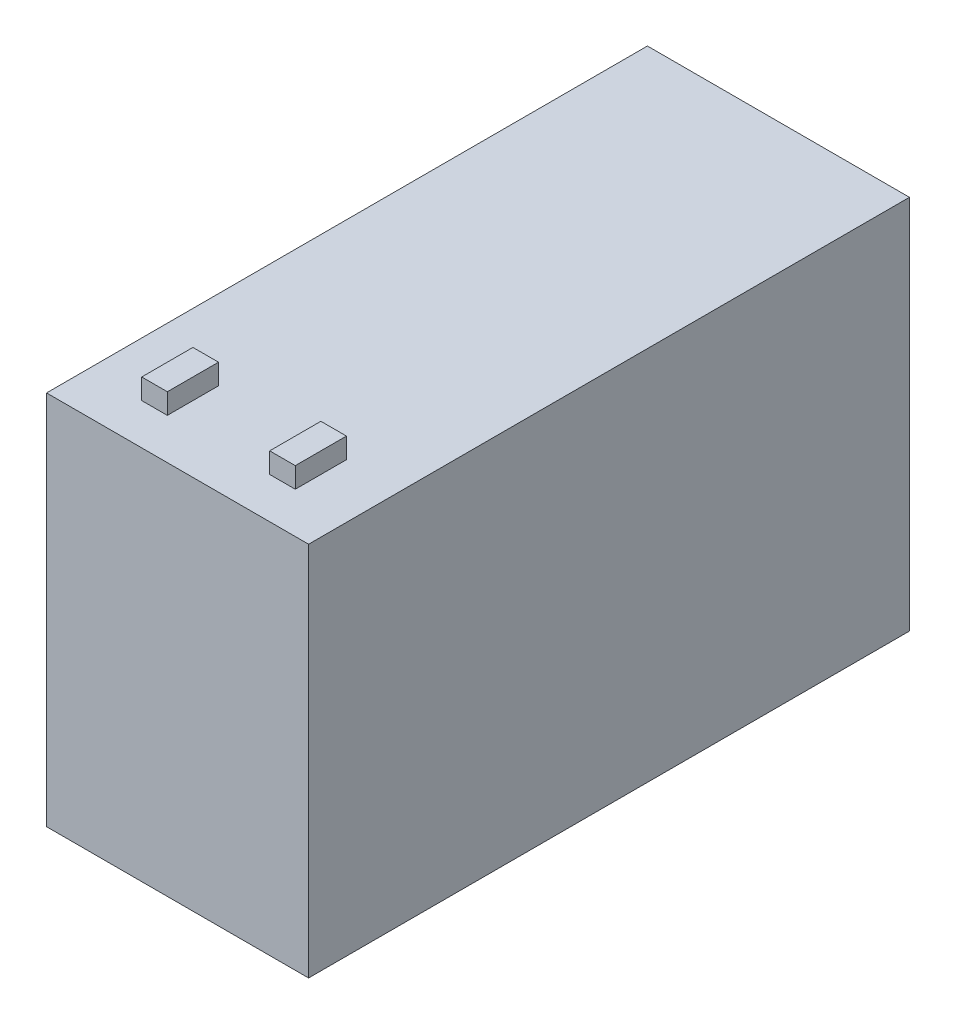
ISO-10303-21;
HEADER;
FILE_DESCRIPTION(('STEP AP214'),'2;1');
FILE_NAME('part.step','',(''),(''),'','','');
FILE_SCHEMA(('AUTOMOTIVE_DESIGN { 1 0 10303 214 1 1 1 1 }'));
ENDSEC;
DATA;
#1=APPLICATION_CONTEXT('core data for automotive mechanical design processes');
#2=APPLICATION_PROTOCOL_DEFINITION('international standard','automotive_design',2000,#1);
#3=PRODUCT_CONTEXT('',#1,'mechanical');
#4=PRODUCT('Part','Part','',(#3));
#5=PRODUCT_RELATED_PRODUCT_CATEGORY('part','',(#4));
#6=PRODUCT_DEFINITION_FORMATION('','',#4);
#7=PRODUCT_DEFINITION_CONTEXT('part definition',#1,'design');
#8=PRODUCT_DEFINITION('design','',#6,#7);
#9=PRODUCT_DEFINITION_SHAPE('','',#8);
#10=(LENGTH_UNIT() NAMED_UNIT(*) SI_UNIT(.MILLI.,.METRE.));
#11=(NAMED_UNIT(*) PLANE_ANGLE_UNIT() SI_UNIT($,.RADIAN.));
#12=(NAMED_UNIT(*) SI_UNIT($,.STERADIAN.) SOLID_ANGLE_UNIT());
#13=UNCERTAINTY_MEASURE_WITH_UNIT(LENGTH_MEASURE(1.E-05),#10,'distance_accuracy_value','');
#14=(GEOMETRIC_REPRESENTATION_CONTEXT(3) GLOBAL_UNCERTAINTY_ASSIGNED_CONTEXT((#13)) GLOBAL_UNIT_ASSIGNED_CONTEXT((#10,
#11,#12)) REPRESENTATION_CONTEXT('',''));
#15=CARTESIAN_POINT('',(0.,0.,0.));
#16=DIRECTION('',(0.,0.,1.));
#17=DIRECTION('',(1.,0.,0.));
#18=AXIS2_PLACEMENT_3D('',#15,#16,#17);
#19=CARTESIAN_POINT('',(0.,93.218,149.098));
#20=DIRECTION('',(0.,-1.,0.));
#21=DIRECTION('',(0.,0.,-1.));
#22=AXIS2_PLACEMENT_3D('',#19,#20,#21);
#23=PLANE('',#22);
#24=DIRECTION('',(0.,0.,-1.));
#25=VECTOR('',#24,1.);
#26=CARTESIAN_POINT('',(51.562,93.218,138.938));
#27=LINE('',#26,#25);
#28=CARTESIAN_POINT('',(51.562,93.218,138.938));
#29=VERTEX_POINT('',#28);
#30=CARTESIAN_POINT('',(51.562,93.218,126.238));
#31=VERTEX_POINT('',#30);
#32=EDGE_CURVE('E138',#29,#31,#27,.T.);
#33=ORIENTED_EDGE('',*,*,#32,.F.);
#34=DIRECTION('',(1.,0.,0.));
#35=VECTOR('',#34,1.);
#36=CARTESIAN_POINT('',(51.562,93.218,138.938));
#37=LINE('',#36,#35);
#38=CARTESIAN_POINT('',(45.212,93.218,138.938));
#39=VERTEX_POINT('',#38);
#40=EDGE_CURVE('E181',#39,#29,#37,.T.);
#41=ORIENTED_EDGE('',*,*,#40,.F.);
#42=DIRECTION('',(0.,0.,1.));
#43=VECTOR('',#42,1.);
#44=CARTESIAN_POINT('',(45.212,93.218,138.938));
#45=LINE('',#44,#43);
#46=CARTESIAN_POINT('',(45.212,93.218,126.238));
#47=VERTEX_POINT('',#46);
#48=EDGE_CURVE('E198',#47,#39,#45,.T.);
#49=ORIENTED_EDGE('',*,*,#48,.F.);
#50=DIRECTION('',(-1.,0.,0.));
#51=VECTOR('',#50,1.);
#52=CARTESIAN_POINT('',(51.562,93.218,126.238));
#53=LINE('',#52,#51);
#54=EDGE_CURVE('E194',#31,#47,#53,.T.);
#55=ORIENTED_EDGE('',*,*,#54,.F.);
#56=EDGE_LOOP('',(#33,#41,#49,#55));
#57=FACE_BOUND('',#56,.T.);
#58=DIRECTION('',(-1.,0.,0.));
#59=VECTOR('',#58,1.);
#60=CARTESIAN_POINT('',(0.,93.218,0.));
#61=LINE('',#60,#59);
#62=CARTESIAN_POINT('',(65.024,93.218,0.));
#63=VERTEX_POINT('',#62);
#64=CARTESIAN_POINT('',(0.,93.218,0.));
#65=VERTEX_POINT('',#64);
#66=EDGE_CURVE('E226',#63,#65,#61,.T.);
#67=ORIENTED_EDGE('',*,*,#66,.T.);
#68=DIRECTION('',(0.,0.,-1.));
#69=VECTOR('',#68,1.);
#70=CARTESIAN_POINT('',(0.,93.218,149.098));
#71=LINE('',#70,#69);
#72=CARTESIAN_POINT('',(0.,93.218,149.098));
#73=VERTEX_POINT('',#72);
#74=EDGE_CURVE('E235',#73,#65,#71,.T.);
#75=ORIENTED_EDGE('',*,*,#74,.F.);
#76=DIRECTION('',(-1.,0.,0.));
#77=VECTOR('',#76,1.);
#78=CARTESIAN_POINT('',(0.,93.218,149.098));
#79=LINE('',#78,#77);
#80=CARTESIAN_POINT('',(65.024,93.218,149.098));
#81=VERTEX_POINT('',#80);
#82=EDGE_CURVE('E232',#81,#73,#79,.T.);
#83=ORIENTED_EDGE('',*,*,#82,.F.);
#84=DIRECTION('',(0.,0.,-1.));
#85=VECTOR('',#84,1.);
#86=CARTESIAN_POINT('',(65.024,93.218,149.098));
#87=LINE('',#86,#85);
#88=EDGE_CURVE('E250',#81,#63,#87,.T.);
#89=ORIENTED_EDGE('',*,*,#88,.T.);
#90=EDGE_LOOP('',(#67,#75,#83,#89));
#91=FACE_BOUND('',#90,.T.);
#92=DIRECTION('',(1.,0.,0.));
#93=VECTOR('',#92,1.);
#94=CARTESIAN_POINT('',(13.462,93.218,138.938));
#95=LINE('',#94,#93);
#96=CARTESIAN_POINT('',(13.462,93.218,138.938));
#97=VERTEX_POINT('',#96);
#98=CARTESIAN_POINT('',(19.812,93.218,138.938));
#99=VERTEX_POINT('',#98);
#100=EDGE_CURVE('E131',#97,#99,#95,.T.);
#101=ORIENTED_EDGE('',*,*,#100,.F.);
#102=DIRECTION('',(0.,0.,1.));
#103=VECTOR('',#102,1.);
#104=CARTESIAN_POINT('',(13.462,93.218,138.938));
#105=LINE('',#104,#103);
#106=CARTESIAN_POINT('',(13.462,93.218,126.238));
#107=VERTEX_POINT('',#106);
#108=EDGE_CURVE('E133',#107,#97,#105,.T.);
#109=ORIENTED_EDGE('',*,*,#108,.F.);
#110=DIRECTION('',(-1.,0.,0.));
#111=VECTOR('',#110,1.);
#112=CARTESIAN_POINT('',(13.462,93.218,126.238));
#113=LINE('',#112,#111);
#114=CARTESIAN_POINT('',(19.812,93.218,126.238));
#115=VERTEX_POINT('',#114);
#116=EDGE_CURVE('E66',#115,#107,#113,.T.);
#117=ORIENTED_EDGE('',*,*,#116,.F.);
#118=DIRECTION('',(0.,0.,-1.));
#119=VECTOR('',#118,1.);
#120=CARTESIAN_POINT('',(19.812,93.218,138.938));
#121=LINE('',#120,#119);
#122=EDGE_CURVE('E61',#99,#115,#121,.T.);
#123=ORIENTED_EDGE('',*,*,#122,.F.);
#124=EDGE_LOOP('',(#101,#109,#117,#123));
#125=FACE_BOUND('',#124,.T.);
#126=ADVANCED_FACE('F45',(#57,#91,#125),#23,.F.);
#127=CARTESIAN_POINT('',(0.,0.,149.098));
#128=DIRECTION('',(1.,0.,0.));
#129=DIRECTION('',(0.,0.,-1.));
#130=AXIS2_PLACEMENT_3D('',#127,#128,#129);
#131=PLANE('',#130);
#132=DIRECTION('',(0.,-1.,0.));
#133=VECTOR('',#132,1.);
#134=CARTESIAN_POINT('',(0.,0.,0.));
#135=LINE('',#134,#133);
#136=CARTESIAN_POINT('',(0.,0.,0.));
#137=VERTEX_POINT('',#136);
#138=EDGE_CURVE('E220',#65,#137,#135,.T.);
#139=ORIENTED_EDGE('',*,*,#138,.T.);
#140=DIRECTION('',(0.,0.,-1.));
#141=VECTOR('',#140,1.);
#142=CARTESIAN_POINT('',(0.,0.,149.098));
#143=LINE('',#142,#141);
#144=CARTESIAN_POINT('',(0.,0.,149.098));
#145=VERTEX_POINT('',#144);
#146=EDGE_CURVE('E11',#145,#137,#143,.T.);
#147=ORIENTED_EDGE('',*,*,#146,.F.);
#148=DIRECTION('',(0.,-1.,0.));
#149=VECTOR('',#148,1.);
#150=CARTESIAN_POINT('',(0.,0.,149.098));
#151=LINE('',#150,#149);
#152=EDGE_CURVE('E221',#73,#145,#151,.T.);
#153=ORIENTED_EDGE('',*,*,#152,.F.);
#154=ORIENTED_EDGE('',*,*,#74,.T.);
#155=EDGE_LOOP('',(#139,#147,#153,#154));
#156=FACE_BOUND('',#155,.T.);
#157=ADVANCED_FACE('F47',(#156),#131,.F.);
#158=CARTESIAN_POINT('',(0.,0.,149.098));
#159=DIRECTION('',(0.,1.,0.));
#160=DIRECTION('',(0.,0.,1.));
#161=AXIS2_PLACEMENT_3D('',#158,#159,#160);
#162=PLANE('',#161);
#163=DIRECTION('',(1.,0.,0.));
#164=VECTOR('',#163,1.);
#165=CARTESIAN_POINT('',(0.,0.,0.));
#166=LINE('',#165,#164);
#167=CARTESIAN_POINT('',(65.024,0.,0.));
#168=VERTEX_POINT('',#167);
#169=EDGE_CURVE('E239',#137,#168,#166,.T.);
#170=ORIENTED_EDGE('',*,*,#169,.T.);
#171=DIRECTION('',(0.,0.,-1.));
#172=VECTOR('',#171,1.);
#173=CARTESIAN_POINT('',(65.024,0.,149.098));
#174=LINE('',#173,#172);
#175=CARTESIAN_POINT('',(65.024,0.,149.098));
#176=VERTEX_POINT('',#175);
#177=EDGE_CURVE('E54',#176,#168,#174,.T.);
#178=ORIENTED_EDGE('',*,*,#177,.F.);
#179=DIRECTION('',(1.,0.,0.));
#180=VECTOR('',#179,1.);
#181=CARTESIAN_POINT('',(0.,0.,149.098));
#182=LINE('',#181,#180);
#183=EDGE_CURVE('E225',#145,#176,#182,.T.);
#184=ORIENTED_EDGE('',*,*,#183,.F.);
#185=ORIENTED_EDGE('',*,*,#146,.T.);
#186=EDGE_LOOP('',(#170,#178,#184,#185));
#187=FACE_BOUND('',#186,.T.);
#188=ADVANCED_FACE('F274',(#187),#162,.F.);
#189=CARTESIAN_POINT('',(65.024,0.,149.098));
#190=DIRECTION('',(-1.,0.,0.));
#191=DIRECTION('',(0.,0.,1.));
#192=AXIS2_PLACEMENT_3D('',#189,#190,#191);
#193=PLANE('',#192);
#194=DIRECTION('',(0.,1.,0.));
#195=VECTOR('',#194,1.);
#196=CARTESIAN_POINT('',(65.024,0.,0.));
#197=LINE('',#196,#195);
#198=EDGE_CURVE('E242',#168,#63,#197,.T.);
#199=ORIENTED_EDGE('',*,*,#198,.T.);
#200=ORIENTED_EDGE('',*,*,#88,.F.);
#201=DIRECTION('',(0.,1.,0.));
#202=VECTOR('',#201,1.);
#203=CARTESIAN_POINT('',(65.024,0.,149.098));
#204=LINE('',#203,#202);
#205=EDGE_CURVE('E229',#176,#81,#204,.T.);
#206=ORIENTED_EDGE('',*,*,#205,.F.);
#207=ORIENTED_EDGE('',*,*,#177,.T.);
#208=EDGE_LOOP('',(#199,#200,#206,#207));
#209=FACE_BOUND('',#208,.T.);
#210=ADVANCED_FACE('F259',(#209),#193,.F.);
#211=CARTESIAN_POINT('',(0.,0.,149.098));
#212=DIRECTION('',(0.,0.,-1.));
#213=DIRECTION('',(-1.,0.,0.));
#214=AXIS2_PLACEMENT_3D('',#211,#212,#213);
#215=PLANE('',#214);
#216=ORIENTED_EDGE('',*,*,#152,.T.);
#217=ORIENTED_EDGE('',*,*,#183,.T.);
#218=ORIENTED_EDGE('',*,*,#205,.T.);
#219=ORIENTED_EDGE('',*,*,#82,.T.);
#220=EDGE_LOOP('',(#216,#217,#218,#219));
#221=FACE_BOUND('',#220,.T.);
#222=ADVANCED_FACE('F273',(#221),#215,.F.);
#223=CARTESIAN_POINT('',(0.,0.,0.));
#224=DIRECTION('',(0.,0.,-1.));
#225=DIRECTION('',(-1.,0.,0.));
#226=AXIS2_PLACEMENT_3D('',#223,#224,#225);
#227=PLANE('',#226);
#228=ORIENTED_EDGE('',*,*,#138,.F.);
#229=ORIENTED_EDGE('',*,*,#66,.F.);
#230=ORIENTED_EDGE('',*,*,#198,.F.);
#231=ORIENTED_EDGE('',*,*,#169,.F.);
#232=EDGE_LOOP('',(#228,#229,#230,#231));
#233=FACE_BOUND('',#232,.T.);
#234=ADVANCED_FACE('F265',(#233),#227,.T.);
#235=CARTESIAN_POINT('',(51.562,98.298,138.938));
#236=DIRECTION('',(-1.,0.,0.));
#237=DIRECTION('',(0.,0.,1.));
#238=AXIS2_PLACEMENT_3D('',#235,#236,#237);
#239=PLANE('',#238);
#240=ORIENTED_EDGE('',*,*,#32,.T.);
#241=DIRECTION('',(0.,-1.,0.));
#242=VECTOR('',#241,1.);
#243=CARTESIAN_POINT('',(51.562,98.298,126.238));
#244=LINE('',#243,#242);
#245=CARTESIAN_POINT('',(51.562,98.298,126.238));
#246=VERTEX_POINT('',#245);
#247=EDGE_CURVE('E216',#246,#31,#244,.T.);
#248=ORIENTED_EDGE('',*,*,#247,.F.);
#249=DIRECTION('',(0.,0.,-1.));
#250=VECTOR('',#249,1.);
#251=CARTESIAN_POINT('',(51.562,98.298,138.938));
#252=LINE('',#251,#250);
#253=CARTESIAN_POINT('',(51.562,98.298,138.938));
#254=VERTEX_POINT('',#253);
#255=EDGE_CURVE('E176',#254,#246,#252,.T.);
#256=ORIENTED_EDGE('',*,*,#255,.F.);
#257=DIRECTION('',(0.,-1.,0.));
#258=VECTOR('',#257,1.);
#259=CARTESIAN_POINT('',(51.562,98.298,138.938));
#260=LINE('',#259,#258);
#261=EDGE_CURVE('E190',#254,#29,#260,.T.);
#262=ORIENTED_EDGE('',*,*,#261,.T.);
#263=EDGE_LOOP('',(#240,#248,#256,#262));
#264=FACE_BOUND('',#263,.T.);
#265=ADVANCED_FACE('F289',(#264),#239,.F.);
#266=CARTESIAN_POINT('',(51.562,98.298,126.238));
#267=DIRECTION('',(0.,0.,1.));
#268=DIRECTION('',(1.,0.,0.));
#269=AXIS2_PLACEMENT_3D('',#266,#267,#268);
#270=PLANE('',#269);
#271=ORIENTED_EDGE('',*,*,#54,.T.);
#272=DIRECTION('',(0.,-1.,0.));
#273=VECTOR('',#272,1.);
#274=CARTESIAN_POINT('',(45.212,98.298,126.238));
#275=LINE('',#274,#273);
#276=CARTESIAN_POINT('',(45.212,98.298,126.238));
#277=VERTEX_POINT('',#276);
#278=EDGE_CURVE('E212',#277,#47,#275,.T.);
#279=ORIENTED_EDGE('',*,*,#278,.F.);
#280=DIRECTION('',(-1.,0.,0.));
#281=VECTOR('',#280,1.);
#282=CARTESIAN_POINT('',(51.562,98.298,126.238));
#283=LINE('',#282,#281);
#284=EDGE_CURVE('E180',#246,#277,#283,.T.);
#285=ORIENTED_EDGE('',*,*,#284,.F.);
#286=ORIENTED_EDGE('',*,*,#247,.T.);
#287=EDGE_LOOP('',(#271,#279,#285,#286));
#288=FACE_BOUND('',#287,.T.);
#289=ADVANCED_FACE('F294',(#288),#270,.F.);
#290=CARTESIAN_POINT('',(45.212,98.298,138.938));
#291=DIRECTION('',(1.,0.,0.));
#292=DIRECTION('',(0.,0.,-1.));
#293=AXIS2_PLACEMENT_3D('',#290,#291,#292);
#294=PLANE('',#293);
#295=ORIENTED_EDGE('',*,*,#48,.T.);
#296=DIRECTION('',(0.,-1.,0.));
#297=VECTOR('',#296,1.);
#298=CARTESIAN_POINT('',(45.212,98.298,138.938));
#299=LINE('',#298,#297);
#300=CARTESIAN_POINT('',(45.212,98.298,138.938));
#301=VERTEX_POINT('',#300);
#302=EDGE_CURVE('E208',#301,#39,#299,.T.);
#303=ORIENTED_EDGE('',*,*,#302,.F.);
#304=DIRECTION('',(0.,0.,1.));
#305=VECTOR('',#304,1.);
#306=CARTESIAN_POINT('',(45.212,98.298,138.938));
#307=LINE('',#306,#305);
#308=EDGE_CURVE('E184',#277,#301,#307,.T.);
#309=ORIENTED_EDGE('',*,*,#308,.F.);
#310=ORIENTED_EDGE('',*,*,#278,.T.);
#311=EDGE_LOOP('',(#295,#303,#309,#310));
#312=FACE_BOUND('',#311,.T.);
#313=ADVANCED_FACE('F298',(#312),#294,.F.);
#314=CARTESIAN_POINT('',(51.562,98.298,138.938));
#315=DIRECTION('',(0.,0.,-1.));
#316=DIRECTION('',(-1.,0.,0.));
#317=AXIS2_PLACEMENT_3D('',#314,#315,#316);
#318=PLANE('',#317);
#319=ORIENTED_EDGE('',*,*,#40,.T.);
#320=ORIENTED_EDGE('',*,*,#261,.F.);
#321=DIRECTION('',(1.,0.,0.));
#322=VECTOR('',#321,1.);
#323=CARTESIAN_POINT('',(51.562,98.298,138.938));
#324=LINE('',#323,#322);
#325=EDGE_CURVE('E187',#301,#254,#324,.T.);
#326=ORIENTED_EDGE('',*,*,#325,.F.);
#327=ORIENTED_EDGE('',*,*,#302,.T.);
#328=EDGE_LOOP('',(#319,#320,#326,#327));
#329=FACE_BOUND('',#328,.T.);
#330=ADVANCED_FACE('F302',(#329),#318,.F.);
#331=CARTESIAN_POINT('',(0.,98.298,0.));
#332=DIRECTION('',(0.,1.,0.));
#333=DIRECTION('',(0.,0.,1.));
#334=AXIS2_PLACEMENT_3D('',#331,#332,#333);
#335=PLANE('',#334);
#336=ORIENTED_EDGE('',*,*,#255,.T.);
#337=ORIENTED_EDGE('',*,*,#284,.T.);
#338=ORIENTED_EDGE('',*,*,#308,.T.);
#339=ORIENTED_EDGE('',*,*,#325,.T.);
#340=EDGE_LOOP('',(#336,#337,#338,#339));
#341=FACE_BOUND('',#340,.T.);
#342=ADVANCED_FACE('F306',(#341),#335,.T.);
#343=CARTESIAN_POINT('',(13.462,98.298,138.938));
#344=DIRECTION('',(0.,0.,-1.));
#345=DIRECTION('',(-1.,0.,0.));
#346=AXIS2_PLACEMENT_3D('',#343,#344,#345);
#347=PLANE('',#346);
#348=ORIENTED_EDGE('',*,*,#100,.T.);
#349=DIRECTION('',(0.,-1.,0.));
#350=VECTOR('',#349,1.);
#351=CARTESIAN_POINT('',(19.812,98.298,138.938));
#352=LINE('',#351,#350);
#353=CARTESIAN_POINT('',(19.812,98.298,138.938));
#354=VERTEX_POINT('',#353);
#355=EDGE_CURVE('E485',#354,#99,#352,.T.);
#356=ORIENTED_EDGE('',*,*,#355,.F.);
#357=DIRECTION('',(1.,0.,0.));
#358=VECTOR('',#357,1.);
#359=CARTESIAN_POINT('',(13.462,98.298,138.938));
#360=LINE('',#359,#358);
#361=CARTESIAN_POINT('',(13.462,98.298,138.938));
#362=VERTEX_POINT('',#361);
#363=EDGE_CURVE('E150',#362,#354,#360,.T.);
#364=ORIENTED_EDGE('',*,*,#363,.F.);
#365=DIRECTION('',(0.,-1.,0.));
#366=VECTOR('',#365,1.);
#367=CARTESIAN_POINT('',(13.462,98.298,138.938));
#368=LINE('',#367,#366);
#369=EDGE_CURVE('E145',#362,#97,#368,.T.);
#370=ORIENTED_EDGE('',*,*,#369,.T.);
#371=EDGE_LOOP('',(#348,#356,#364,#370));
#372=FACE_BOUND('',#371,.T.);
#373=ADVANCED_FACE('F152',(#372),#347,.F.);
#374=CARTESIAN_POINT('',(19.812,98.298,138.938));
#375=DIRECTION('',(-1.,0.,0.));
#376=DIRECTION('',(0.,0.,1.));
#377=AXIS2_PLACEMENT_3D('',#374,#375,#376);
#378=PLANE('',#377);
#379=ORIENTED_EDGE('',*,*,#122,.T.);
#380=DIRECTION('',(0.,-1.,0.));
#381=VECTOR('',#380,1.);
#382=CARTESIAN_POINT('',(19.812,98.298,126.238));
#383=LINE('',#382,#381);
#384=CARTESIAN_POINT('',(19.812,98.298,126.238));
#385=VERTEX_POINT('',#384);
#386=EDGE_CURVE('E161',#385,#115,#383,.T.);
#387=ORIENTED_EDGE('',*,*,#386,.F.);
#388=DIRECTION('',(0.,0.,-1.));
#389=VECTOR('',#388,1.);
#390=CARTESIAN_POINT('',(19.812,98.298,138.938));
#391=LINE('',#390,#389);
#392=EDGE_CURVE('E171',#354,#385,#391,.T.);
#393=ORIENTED_EDGE('',*,*,#392,.F.);
#394=ORIENTED_EDGE('',*,*,#355,.T.);
#395=EDGE_LOOP('',(#379,#387,#393,#394));
#396=FACE_BOUND('',#395,.T.);
#397=ADVANCED_FACE('F320',(#396),#378,.F.);
#398=CARTESIAN_POINT('',(13.462,98.298,126.238));
#399=DIRECTION('',(0.,0.,1.));
#400=DIRECTION('',(1.,0.,0.));
#401=AXIS2_PLACEMENT_3D('',#398,#399,#400);
#402=PLANE('',#401);
#403=ORIENTED_EDGE('',*,*,#116,.T.);
#404=DIRECTION('',(0.,-1.,0.));
#405=VECTOR('',#404,1.);
#406=CARTESIAN_POINT('',(13.462,98.298,126.238));
#407=LINE('',#406,#405);
#408=CARTESIAN_POINT('',(13.462,98.298,126.238));
#409=VERTEX_POINT('',#408);
#410=EDGE_CURVE('E148',#409,#107,#407,.T.);
#411=ORIENTED_EDGE('',*,*,#410,.F.);
#412=DIRECTION('',(-1.,0.,0.));
#413=VECTOR('',#412,1.);
#414=CARTESIAN_POINT('',(13.462,98.298,126.238));
#415=LINE('',#414,#413);
#416=EDGE_CURVE('E159',#385,#409,#415,.T.);
#417=ORIENTED_EDGE('',*,*,#416,.F.);
#418=ORIENTED_EDGE('',*,*,#386,.T.);
#419=EDGE_LOOP('',(#403,#411,#417,#418));
#420=FACE_BOUND('',#419,.T.);
#421=ADVANCED_FACE('F317',(#420),#402,.F.);
#422=CARTESIAN_POINT('',(13.462,98.298,138.938));
#423=DIRECTION('',(1.,0.,0.));
#424=DIRECTION('',(0.,0.,-1.));
#425=AXIS2_PLACEMENT_3D('',#422,#423,#424);
#426=PLANE('',#425);
#427=ORIENTED_EDGE('',*,*,#108,.T.);
#428=ORIENTED_EDGE('',*,*,#369,.F.);
#429=DIRECTION('',(0.,0.,1.));
#430=VECTOR('',#429,1.);
#431=CARTESIAN_POINT('',(13.462,98.298,138.938));
#432=LINE('',#431,#430);
#433=EDGE_CURVE('E155',#409,#362,#432,.T.);
#434=ORIENTED_EDGE('',*,*,#433,.F.);
#435=ORIENTED_EDGE('',*,*,#410,.T.);
#436=EDGE_LOOP('',(#427,#428,#434,#435));
#437=FACE_BOUND('',#436,.T.);
#438=ADVANCED_FACE('F143',(#437),#426,.F.);
#439=CARTESIAN_POINT('',(0.,98.298,0.));
#440=DIRECTION('',(0.,1.,0.));
#441=DIRECTION('',(0.,0.,1.));
#442=AXIS2_PLACEMENT_3D('',#439,#440,#441);
#443=PLANE('',#442);
#444=ORIENTED_EDGE('',*,*,#363,.T.);
#445=ORIENTED_EDGE('',*,*,#392,.T.);
#446=ORIENTED_EDGE('',*,*,#416,.T.);
#447=ORIENTED_EDGE('',*,*,#433,.T.);
#448=EDGE_LOOP('',(#444,#445,#446,#447));
#449=FACE_BOUND('',#448,.T.);
#450=ADVANCED_FACE('F311',(#449),#443,.T.);
#451=CLOSED_SHELL('',(#126,#157,#188,#210,#222,#234,#265,#289,#313,#330,#342,#373,#397,#421,
#438,#450));
#452=MANIFOLD_SOLID_BREP('B2',#451);
#453=ADVANCED_BREP_SHAPE_REPRESENTATION('',(#18,#452),#14);
#454=SHAPE_DEFINITION_REPRESENTATION(#9,#453);
ENDSEC;
END-ISO-10303-21;
